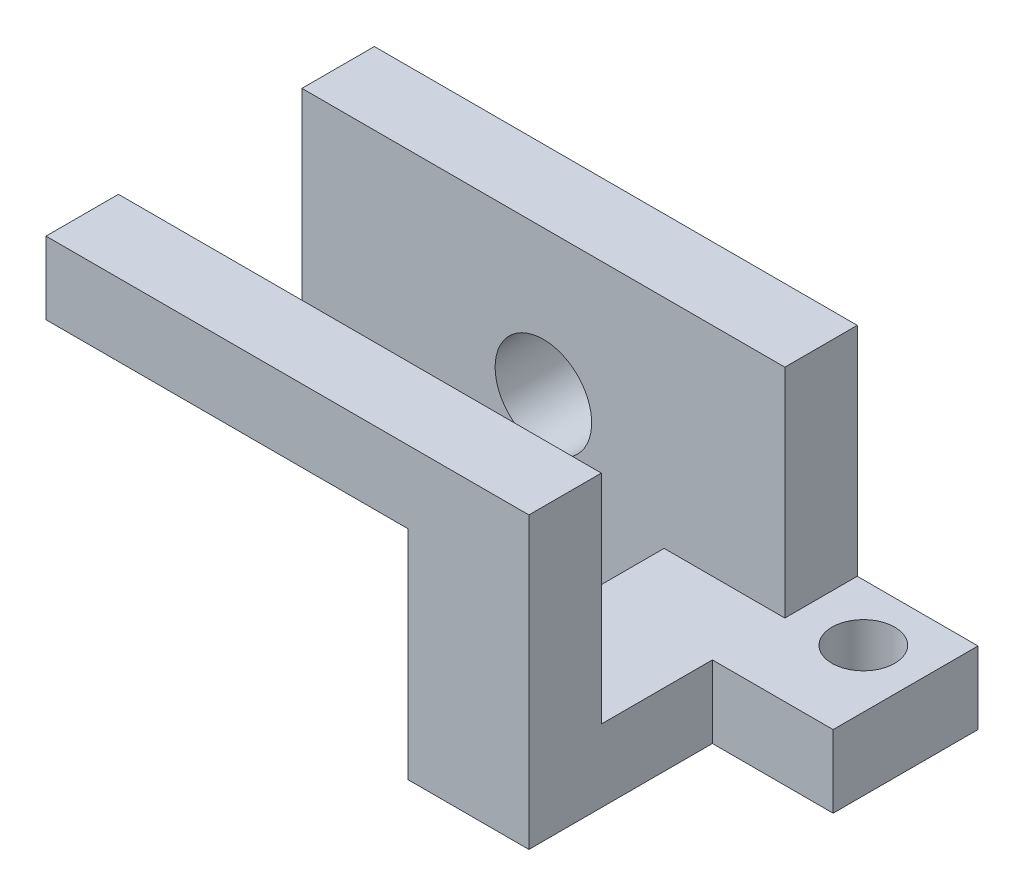
ISO-10303-21;
HEADER;
FILE_DESCRIPTION(('STEP AP214'),'2;1');
FILE_NAME('part.step','',(''),(''),'','','');
FILE_SCHEMA(('AUTOMOTIVE_DESIGN { 1 0 10303 214 1 1 1 1 }'));
ENDSEC;
DATA;
#1=APPLICATION_CONTEXT('core data for automotive mechanical design processes');
#2=APPLICATION_PROTOCOL_DEFINITION('international standard','automotive_design',2000,#1);
#3=PRODUCT_CONTEXT('',#1,'mechanical');
#4=PRODUCT('Part','Part','',(#3));
#5=PRODUCT_RELATED_PRODUCT_CATEGORY('part','',(#4));
#6=PRODUCT_DEFINITION_FORMATION('','',#4);
#7=PRODUCT_DEFINITION_CONTEXT('part definition',#1,'design');
#8=PRODUCT_DEFINITION('design','',#6,#7);
#9=PRODUCT_DEFINITION_SHAPE('','',#8);
#10=(LENGTH_UNIT() NAMED_UNIT(*) SI_UNIT(.MILLI.,.METRE.));
#11=(NAMED_UNIT(*) PLANE_ANGLE_UNIT() SI_UNIT($,.RADIAN.));
#12=(NAMED_UNIT(*) SI_UNIT($,.STERADIAN.) SOLID_ANGLE_UNIT());
#13=UNCERTAINTY_MEASURE_WITH_UNIT(LENGTH_MEASURE(1.E-05),#10,'distance_accuracy_value','');
#14=(GEOMETRIC_REPRESENTATION_CONTEXT(3) GLOBAL_UNCERTAINTY_ASSIGNED_CONTEXT((#13)) GLOBAL_UNIT_ASSIGNED_CONTEXT((#10,
#11,#12)) REPRESENTATION_CONTEXT('',''));
#15=CARTESIAN_POINT('',(0.,0.,0.));
#16=DIRECTION('',(0.,0.,1.));
#17=DIRECTION('',(1.,0.,0.));
#18=AXIS2_PLACEMENT_3D('',#15,#16,#17);
#19=CARTESIAN_POINT('',(0.,0.,15.));
#20=DIRECTION('',(-1.,0.,0.));
#21=DIRECTION('',(0.,0.,1.));
#22=AXIS2_PLACEMENT_3D('',#19,#20,#21);
#23=PLANE('',#22);
#24=DIRECTION('',(0.,-1.,0.));
#25=VECTOR('',#24,1.);
#26=CARTESIAN_POINT('',(0.,0.,30.));
#27=LINE('',#26,#25);
#28=CARTESIAN_POINT('',(0.,15.,30.));
#29=VERTEX_POINT('',#28);
#30=CARTESIAN_POINT('',(0.,0.,30.));
#31=VERTEX_POINT('',#30);
#32=EDGE_CURVE('E159',#29,#31,#27,.T.);
#33=ORIENTED_EDGE('',*,*,#32,.F.);
#34=DIRECTION('',(0.,0.,-1.));
#35=VECTOR('',#34,1.);
#36=CARTESIAN_POINT('',(0.,15.,53.));
#37=LINE('',#36,#35);
#38=CARTESIAN_POINT('',(0.,15.,53.));
#39=VERTEX_POINT('',#38);
#40=EDGE_CURVE('E219',#39,#29,#37,.T.);
#41=ORIENTED_EDGE('',*,*,#40,.F.);
#42=DIRECTION('',(0.,1.,0.));
#43=VECTOR('',#42,1.);
#44=CARTESIAN_POINT('',(0.,0.,53.));
#45=LINE('',#44,#43);
#46=CARTESIAN_POINT('',(0.,60.,53.));
#47=VERTEX_POINT('',#46);
#48=EDGE_CURVE('E182',#39,#47,#45,.T.);
#49=ORIENTED_EDGE('',*,*,#48,.T.);
#50=DIRECTION('',(0.,0.,-1.));
#51=VECTOR('',#50,1.);
#52=CARTESIAN_POINT('',(0.,60.,68.));
#53=LINE('',#52,#51);
#54=CARTESIAN_POINT('',(0.,60.,68.));
#55=VERTEX_POINT('',#54);
#56=EDGE_CURVE('E203',#55,#47,#53,.T.);
#57=ORIENTED_EDGE('',*,*,#56,.F.);
#58=DIRECTION('',(0.,1.,0.));
#59=VECTOR('',#58,1.);
#60=CARTESIAN_POINT('',(0.,0.,68.));
#61=LINE('',#60,#59);
#62=CARTESIAN_POINT('',(0.,0.,68.));
#63=VERTEX_POINT('',#62);
#64=EDGE_CURVE('E184',#63,#55,#61,.T.);
#65=ORIENTED_EDGE('',*,*,#64,.F.);
#66=DIRECTION('',(0.,0.,-1.));
#67=VECTOR('',#66,1.);
#68=CARTESIAN_POINT('',(0.,0.,15.));
#69=LINE('',#68,#67);
#70=EDGE_CURVE('E229',#63,#31,#69,.T.);
#71=ORIENTED_EDGE('',*,*,#70,.T.);
#72=EDGE_LOOP('',(#33,#41,#49,#57,#65,#71));
#73=FACE_BOUND('',#72,.T.);
#74=ADVANCED_FACE('F39',(#73),#23,.F.);
#75=DIRECTION('',(0.,0.,1.));
#76=VECTOR('',#75,1.);
#77=CARTESIAN_POINT('',(0.,15.,0.));
#78=LINE('',#77,#76);
#79=CARTESIAN_POINT('',(0.,15.,0.));
#80=VERTEX_POINT('',#79);
#81=CARTESIAN_POINT('',(0.,15.,15.));
#82=VERTEX_POINT('',#81);
#83=EDGE_CURVE('E274',#80,#82,#78,.T.);
#84=ORIENTED_EDGE('',*,*,#83,.F.);
#85=DIRECTION('',(0.,1.,0.));
#86=VECTOR('',#85,1.);
#87=CARTESIAN_POINT('',(0.,0.,0.));
#88=LINE('',#87,#86);
#89=CARTESIAN_POINT('',(0.,60.,0.));
#90=VERTEX_POINT('',#89);
#91=EDGE_CURVE('E164',#80,#90,#88,.T.);
#92=ORIENTED_EDGE('',*,*,#91,.T.);
#93=DIRECTION('',(0.,0.,-1.));
#94=VECTOR('',#93,1.);
#95=CARTESIAN_POINT('',(0.,60.,15.));
#96=LINE('',#95,#94);
#97=CARTESIAN_POINT('',(0.,60.,15.));
#98=VERTEX_POINT('',#97);
#99=EDGE_CURVE('E11',#98,#90,#96,.T.);
#100=ORIENTED_EDGE('',*,*,#99,.F.);
#101=DIRECTION('',(0.,1.,0.));
#102=VECTOR('',#101,1.);
#103=CARTESIAN_POINT('',(0.,0.,15.));
#104=LINE('',#103,#102);
#105=EDGE_CURVE('E221',#82,#98,#104,.T.);
#106=ORIENTED_EDGE('',*,*,#105,.F.);
#107=EDGE_LOOP('',(#84,#92,#100,#106));
#108=FACE_BOUND('',#107,.T.);
#109=ADVANCED_FACE('F279',(#108),#23,.F.);
#110=CARTESIAN_POINT('',(0.,60.,15.));
#111=DIRECTION('',(0.,-1.,0.));
#112=DIRECTION('',(1.,0.,0.));
#113=AXIS2_PLACEMENT_3D('',#110,#111,#112);
#114=PLANE('',#113);
#115=DIRECTION('',(-1.,0.,0.));
#116=VECTOR('',#115,1.);
#117=CARTESIAN_POINT('',(0.,60.,0.));
#118=LINE('',#117,#116);
#119=CARTESIAN_POINT('',(-100.,60.,0.));
#120=VERTEX_POINT('',#119);
#121=EDGE_CURVE('E231',#90,#120,#118,.T.);
#122=ORIENTED_EDGE('',*,*,#121,.T.);
#123=DIRECTION('',(0.,0.,-1.));
#124=VECTOR('',#123,1.);
#125=CARTESIAN_POINT('',(-100.,60.,15.));
#126=LINE('',#125,#124);
#127=CARTESIAN_POINT('',(-100.,60.,15.));
#128=VERTEX_POINT('',#127);
#129=EDGE_CURVE('E46',#128,#120,#126,.T.);
#130=ORIENTED_EDGE('',*,*,#129,.F.);
#131=DIRECTION('',(-1.,0.,0.));
#132=VECTOR('',#131,1.);
#133=CARTESIAN_POINT('',(0.,60.,15.));
#134=LINE('',#133,#132);
#135=EDGE_CURVE('E223',#98,#128,#134,.T.);
#136=ORIENTED_EDGE('',*,*,#135,.F.);
#137=ORIENTED_EDGE('',*,*,#99,.T.);
#138=EDGE_LOOP('',(#122,#130,#136,#137));
#139=FACE_BOUND('',#138,.T.);
#140=ADVANCED_FACE('F280',(#139),#114,.F.);
#141=CARTESIAN_POINT('',(-100.,0.,15.));
#142=DIRECTION('',(1.,0.,0.));
#143=DIRECTION('',(0.,0.,-1.));
#144=AXIS2_PLACEMENT_3D('',#141,#142,#143);
#145=PLANE('',#144);
#146=DIRECTION('',(0.,-1.,0.));
#147=VECTOR('',#146,1.);
#148=CARTESIAN_POINT('',(-100.,0.,0.));
#149=LINE('',#148,#147);
#150=CARTESIAN_POINT('',(-100.,0.,0.));
#151=VERTEX_POINT('',#150);
#152=EDGE_CURVE('E233',#120,#151,#149,.T.);
#153=ORIENTED_EDGE('',*,*,#152,.T.);
#154=DIRECTION('',(0.,0.,-1.));
#155=VECTOR('',#154,1.);
#156=CARTESIAN_POINT('',(-100.,0.,15.));
#157=LINE('',#156,#155);
#158=CARTESIAN_POINT('',(-100.,0.,15.));
#159=VERTEX_POINT('',#158);
#160=EDGE_CURVE('E238',#159,#151,#157,.T.);
#161=ORIENTED_EDGE('',*,*,#160,.F.);
#162=DIRECTION('',(0.,-1.,0.));
#163=VECTOR('',#162,1.);
#164=CARTESIAN_POINT('',(-100.,0.,15.));
#165=LINE('',#164,#163);
#166=EDGE_CURVE('E226',#128,#159,#165,.T.);
#167=ORIENTED_EDGE('',*,*,#166,.F.);
#168=ORIENTED_EDGE('',*,*,#129,.T.);
#169=EDGE_LOOP('',(#153,#161,#167,#168));
#170=FACE_BOUND('',#169,.T.);
#171=ADVANCED_FACE('F245',(#170),#145,.F.);
#172=CARTESIAN_POINT('',(0.,0.,15.));
#173=DIRECTION('',(0.,1.,0.));
#174=DIRECTION('',(0.,0.,1.));
#175=AXIS2_PLACEMENT_3D('',#172,#173,#174);
#176=PLANE('',#175);
#177=CARTESIAN_POINT('',(13.,0.,11.7414052517134));
#178=DIRECTION('',(0.,1.,0.));
#179=DIRECTION('',(-1.,0.,0.));
#180=AXIS2_PLACEMENT_3D('',#177,#178,#179);
#181=CIRCLE('',#180,6.5);
#182=CARTESIAN_POINT('',(6.50000000000001,0.,11.7414052517134));
#183=VERTEX_POINT('',#182);
#184=EDGE_CURVE('E297',#183,#183,#181,.T.);
#185=ORIENTED_EDGE('',*,*,#184,.T.);
#186=EDGE_LOOP('',(#185));
#187=FACE_BOUND('',#186,.T.);
#188=DIRECTION('',(1.,0.,0.));
#189=VECTOR('',#188,1.);
#190=CARTESIAN_POINT('',(0.,0.,68.));
#191=LINE('',#190,#189);
#192=CARTESIAN_POINT('',(-25.,0.,68.));
#193=VERTEX_POINT('',#192);
#194=EDGE_CURVE('E193',#193,#63,#191,.T.);
#195=ORIENTED_EDGE('',*,*,#194,.F.);
#196=DIRECTION('',(0.,0.,-1.));
#197=VECTOR('',#196,1.);
#198=CARTESIAN_POINT('',(-25.,0.,53.));
#199=LINE('',#198,#197);
#200=CARTESIAN_POINT('',(-25.,0.,15.));
#201=VERTEX_POINT('',#200);
#202=EDGE_CURVE('E210',#193,#201,#199,.T.);
#203=ORIENTED_EDGE('',*,*,#202,.T.);
#204=DIRECTION('',(1.,0.,0.));
#205=VECTOR('',#204,1.);
#206=CARTESIAN_POINT('',(0.,0.,15.));
#207=LINE('',#206,#205);
#208=EDGE_CURVE('E61',#159,#201,#207,.T.);
#209=ORIENTED_EDGE('',*,*,#208,.F.);
#210=ORIENTED_EDGE('',*,*,#160,.T.);
#211=DIRECTION('',(1.,0.,0.));
#212=VECTOR('',#211,1.);
#213=CARTESIAN_POINT('',(0.,0.,0.));
#214=LINE('',#213,#212);
#215=CARTESIAN_POINT('',(25.,0.,0.));
#216=VERTEX_POINT('',#215);
#217=EDGE_CURVE('E224',#151,#216,#214,.T.);
#218=ORIENTED_EDGE('',*,*,#217,.T.);
#219=DIRECTION('',(0.,0.,-1.));
#220=VECTOR('',#219,1.);
#221=CARTESIAN_POINT('',(25.,0.,0.));
#222=LINE('',#221,#220);
#223=CARTESIAN_POINT('',(25.,0.,30.));
#224=VERTEX_POINT('',#223);
#225=EDGE_CURVE('E156',#224,#216,#222,.T.);
#226=ORIENTED_EDGE('',*,*,#225,.F.);
#227=DIRECTION('',(-1.,0.,0.));
#228=VECTOR('',#227,1.);
#229=CARTESIAN_POINT('',(25.,0.,30.));
#230=LINE('',#229,#228);
#231=EDGE_CURVE('E169',#224,#31,#230,.T.);
#232=ORIENTED_EDGE('',*,*,#231,.T.);
#233=ORIENTED_EDGE('',*,*,#70,.F.);
#234=EDGE_LOOP('',(#195,#203,#209,#210,#218,#226,#232,#233));
#235=FACE_BOUND('',#234,.T.);
#236=ADVANCED_FACE('F251',(#187,#235),#176,.F.);
#237=CARTESIAN_POINT('',(0.,0.,15.));
#238=DIRECTION('',(0.,0.,1.));
#239=DIRECTION('',(1.,0.,0.));
#240=AXIS2_PLACEMENT_3D('',#237,#238,#239);
#241=PLANE('',#240);
#242=CARTESIAN_POINT('',(-50.,30.,15.));
#243=DIRECTION('',(0.,0.,-1.));
#244=DIRECTION('',(-1.,0.,0.));
#245=AXIS2_PLACEMENT_3D('',#242,#243,#244);
#246=CIRCLE('',#245,10.);
#247=CARTESIAN_POINT('',(-60.,30.,15.));
#248=VERTEX_POINT('',#247);
#249=EDGE_CURVE('E305',#248,#248,#246,.T.);
#250=ORIENTED_EDGE('',*,*,#249,.T.);
#251=EDGE_LOOP('',(#250));
#252=FACE_BOUND('',#251,.T.);
#253=DIRECTION('',(0.,-1.,0.));
#254=VECTOR('',#253,1.);
#255=CARTESIAN_POINT('',(-25.,0.,15.));
#256=LINE('',#255,#254);
#257=CARTESIAN_POINT('',(-25.,15.,15.));
#258=VERTEX_POINT('',#257);
#259=EDGE_CURVE('E211',#258,#201,#256,.T.);
#260=ORIENTED_EDGE('',*,*,#259,.F.);
#261=DIRECTION('',(-1.,0.,0.));
#262=VECTOR('',#261,1.);
#263=CARTESIAN_POINT('',(0.,15.,15.));
#264=LINE('',#263,#262);
#265=EDGE_CURVE('E206',#82,#258,#264,.T.);
#266=ORIENTED_EDGE('',*,*,#265,.F.);
#267=ORIENTED_EDGE('',*,*,#105,.T.);
#268=ORIENTED_EDGE('',*,*,#135,.T.);
#269=ORIENTED_EDGE('',*,*,#166,.T.);
#270=ORIENTED_EDGE('',*,*,#208,.T.);
#271=EDGE_LOOP('',(#260,#266,#267,#268,#269,#270));
#272=FACE_BOUND('',#271,.T.);
#273=ADVANCED_FACE('F276',(#252,#272),#241,.T.);
#274=CARTESIAN_POINT('',(0.,0.,0.));
#275=DIRECTION('',(0.,0.,1.));
#276=DIRECTION('',(1.,0.,0.));
#277=AXIS2_PLACEMENT_3D('',#274,#275,#276);
#278=PLANE('',#277);
#279=CARTESIAN_POINT('',(-50.,30.,0.));
#280=DIRECTION('',(0.,0.,-1.));
#281=DIRECTION('',(-1.,0.,0.));
#282=AXIS2_PLACEMENT_3D('',#279,#280,#281);
#283=CIRCLE('',#282,10.);
#284=CARTESIAN_POINT('',(-60.,30.,0.));
#285=VERTEX_POINT('',#284);
#286=EDGE_CURVE('E308',#285,#285,#283,.T.);
#287=ORIENTED_EDGE('',*,*,#286,.F.);
#288=EDGE_LOOP('',(#287));
#289=FACE_BOUND('',#288,.T.);
#290=ORIENTED_EDGE('',*,*,#91,.F.);
#291=DIRECTION('',(-1.,0.,0.));
#292=VECTOR('',#291,1.);
#293=CARTESIAN_POINT('',(25.,15.,0.));
#294=LINE('',#293,#292);
#295=CARTESIAN_POINT('',(25.,15.,0.));
#296=VERTEX_POINT('',#295);
#297=EDGE_CURVE('E143',#296,#80,#294,.T.);
#298=ORIENTED_EDGE('',*,*,#297,.F.);
#299=DIRECTION('',(0.,1.,0.));
#300=VECTOR('',#299,1.);
#301=CARTESIAN_POINT('',(25.,0.,0.));
#302=LINE('',#301,#300);
#303=EDGE_CURVE('E150',#216,#296,#302,.T.);
#304=ORIENTED_EDGE('',*,*,#303,.F.);
#305=ORIENTED_EDGE('',*,*,#217,.F.);
#306=ORIENTED_EDGE('',*,*,#152,.F.);
#307=ORIENTED_EDGE('',*,*,#121,.F.);
#308=EDGE_LOOP('',(#290,#298,#304,#305,#306,#307));
#309=FACE_BOUND('',#308,.T.);
#310=ADVANCED_FACE('F162',(#289,#309),#278,.F.);
#311=CARTESIAN_POINT('',(0.,15.,53.));
#312=DIRECTION('',(0.,-1.,0.));
#313=DIRECTION('',(1.,0.,0.));
#314=AXIS2_PLACEMENT_3D('',#311,#312,#313);
#315=PLANE('',#314);
#316=CARTESIAN_POINT('',(13.,15.,11.7414052517134));
#317=DIRECTION('',(0.,1.,0.));
#318=DIRECTION('',(-1.,0.,0.));
#319=AXIS2_PLACEMENT_3D('',#316,#317,#318);
#320=CIRCLE('',#319,6.5);
#321=CARTESIAN_POINT('',(6.5,15.,11.7414052517134));
#322=VERTEX_POINT('',#321);
#323=EDGE_CURVE('E302',#322,#322,#320,.T.);
#324=ORIENTED_EDGE('',*,*,#323,.F.);
#325=EDGE_LOOP('',(#324));
#326=FACE_BOUND('',#325,.T.);
#327=ORIENTED_EDGE('',*,*,#265,.T.);
#328=DIRECTION('',(0.,0.,-1.));
#329=VECTOR('',#328,1.);
#330=CARTESIAN_POINT('',(-25.,15.,53.));
#331=LINE('',#330,#329);
#332=CARTESIAN_POINT('',(-25.,15.,53.));
#333=VERTEX_POINT('',#332);
#334=EDGE_CURVE('E216',#333,#258,#331,.T.);
#335=ORIENTED_EDGE('',*,*,#334,.F.);
#336=DIRECTION('',(-1.,0.,0.));
#337=VECTOR('',#336,1.);
#338=CARTESIAN_POINT('',(0.,15.,53.));
#339=LINE('',#338,#337);
#340=EDGE_CURVE('E207',#39,#333,#339,.T.);
#341=ORIENTED_EDGE('',*,*,#340,.F.);
#342=ORIENTED_EDGE('',*,*,#40,.T.);
#343=DIRECTION('',(-1.,0.,0.));
#344=VECTOR('',#343,1.);
#345=CARTESIAN_POINT('',(25.,15.,30.));
#346=LINE('',#345,#344);
#347=CARTESIAN_POINT('',(25.,15.,30.));
#348=VERTEX_POINT('',#347);
#349=EDGE_CURVE('E146',#348,#29,#346,.T.);
#350=ORIENTED_EDGE('',*,*,#349,.F.);
#351=DIRECTION('',(0.,0.,1.));
#352=VECTOR('',#351,1.);
#353=CARTESIAN_POINT('',(25.,15.,0.));
#354=LINE('',#353,#352);
#355=EDGE_CURVE('E138',#296,#348,#354,.T.);
#356=ORIENTED_EDGE('',*,*,#355,.F.);
#357=ORIENTED_EDGE('',*,*,#297,.T.);
#358=ORIENTED_EDGE('',*,*,#83,.T.);
#359=EDGE_LOOP('',(#327,#335,#341,#342,#350,#356,#357,#358));
#360=FACE_BOUND('',#359,.T.);
#361=ADVANCED_FACE('F141',(#326,#360),#315,.F.);
#362=CARTESIAN_POINT('',(-25.,0.,53.));
#363=DIRECTION('',(1.,0.,0.));
#364=DIRECTION('',(0.,0.,-1.));
#365=AXIS2_PLACEMENT_3D('',#362,#363,#364);
#366=PLANE('',#365);
#367=ORIENTED_EDGE('',*,*,#259,.T.);
#368=ORIENTED_EDGE('',*,*,#202,.F.);
#369=DIRECTION('',(0.,-1.,0.));
#370=VECTOR('',#369,1.);
#371=CARTESIAN_POINT('',(-25.,0.,68.));
#372=LINE('',#371,#370);
#373=CARTESIAN_POINT('',(-25.,45.,68.));
#374=VERTEX_POINT('',#373);
#375=EDGE_CURVE('E53',#374,#193,#372,.T.);
#376=ORIENTED_EDGE('',*,*,#375,.F.);
#377=DIRECTION('',(0.,0.,-1.));
#378=VECTOR('',#377,1.);
#379=CARTESIAN_POINT('',(-25.,45.,68.));
#380=LINE('',#379,#378);
#381=CARTESIAN_POINT('',(-25.,45.,53.));
#382=VERTEX_POINT('',#381);
#383=EDGE_CURVE('E180',#374,#382,#380,.T.);
#384=ORIENTED_EDGE('',*,*,#383,.T.);
#385=DIRECTION('',(0.,-1.,0.));
#386=VECTOR('',#385,1.);
#387=CARTESIAN_POINT('',(-25.,0.,53.));
#388=LINE('',#387,#386);
#389=EDGE_CURVE('E165',#382,#333,#388,.T.);
#390=ORIENTED_EDGE('',*,*,#389,.T.);
#391=ORIENTED_EDGE('',*,*,#334,.T.);
#392=EDGE_LOOP('',(#367,#368,#376,#384,#390,#391));
#393=FACE_BOUND('',#392,.T.);
#394=ADVANCED_FACE('F254',(#393),#366,.F.);
#395=CARTESIAN_POINT('',(0.,0.,53.));
#396=DIRECTION('',(0.,0.,1.));
#397=DIRECTION('',(1.,0.,0.));
#398=AXIS2_PLACEMENT_3D('',#395,#396,#397);
#399=PLANE('',#398);
#400=ORIENTED_EDGE('',*,*,#340,.T.);
#401=ORIENTED_EDGE('',*,*,#389,.F.);
#402=DIRECTION('',(1.,0.,0.));
#403=VECTOR('',#402,1.);
#404=CARTESIAN_POINT('',(-25.,45.,53.));
#405=LINE('',#404,#403);
#406=CARTESIAN_POINT('',(-100.,45.,53.));
#407=VERTEX_POINT('',#406);
#408=EDGE_CURVE('E167',#407,#382,#405,.T.);
#409=ORIENTED_EDGE('',*,*,#408,.F.);
#410=DIRECTION('',(0.,-1.,0.));
#411=VECTOR('',#410,1.);
#412=CARTESIAN_POINT('',(-100.,0.,53.));
#413=LINE('',#412,#411);
#414=CARTESIAN_POINT('',(-100.,60.,53.));
#415=VERTEX_POINT('',#414);
#416=EDGE_CURVE('E188',#415,#407,#413,.T.);
#417=ORIENTED_EDGE('',*,*,#416,.F.);
#418=DIRECTION('',(-1.,0.,0.));
#419=VECTOR('',#418,1.);
#420=CARTESIAN_POINT('',(0.,60.,53.));
#421=LINE('',#420,#419);
#422=EDGE_CURVE('E197',#47,#415,#421,.T.);
#423=ORIENTED_EDGE('',*,*,#422,.F.);
#424=ORIENTED_EDGE('',*,*,#48,.F.);
#425=EDGE_LOOP('',(#400,#401,#409,#417,#423,#424));
#426=FACE_BOUND('',#425,.T.);
#427=ADVANCED_FACE('F268',(#426),#399,.F.);
#428=CARTESIAN_POINT('',(0.,60.,68.));
#429=DIRECTION('',(0.,-1.,0.));
#430=DIRECTION('',(0.,0.,-1.));
#431=AXIS2_PLACEMENT_3D('',#428,#429,#430);
#432=PLANE('',#431);
#433=ORIENTED_EDGE('',*,*,#422,.T.);
#434=DIRECTION('',(0.,0.,-1.));
#435=VECTOR('',#434,1.);
#436=CARTESIAN_POINT('',(-100.,60.,68.));
#437=LINE('',#436,#435);
#438=CARTESIAN_POINT('',(-100.,60.,68.));
#439=VERTEX_POINT('',#438);
#440=EDGE_CURVE('E195',#439,#415,#437,.T.);
#441=ORIENTED_EDGE('',*,*,#440,.F.);
#442=DIRECTION('',(-1.,0.,0.));
#443=VECTOR('',#442,1.);
#444=CARTESIAN_POINT('',(0.,60.,68.));
#445=LINE('',#444,#443);
#446=EDGE_CURVE('E187',#55,#439,#445,.T.);
#447=ORIENTED_EDGE('',*,*,#446,.F.);
#448=ORIENTED_EDGE('',*,*,#56,.T.);
#449=EDGE_LOOP('',(#433,#441,#447,#448));
#450=FACE_BOUND('',#449,.T.);
#451=ADVANCED_FACE('F355',(#450),#432,.F.);
#452=CARTESIAN_POINT('',(-100.,0.,68.));
#453=DIRECTION('',(1.,0.,0.));
#454=DIRECTION('',(0.,0.,-1.));
#455=AXIS2_PLACEMENT_3D('',#452,#453,#454);
#456=PLANE('',#455);
#457=ORIENTED_EDGE('',*,*,#416,.T.);
#458=DIRECTION('',(0.,0.,-1.));
#459=VECTOR('',#458,1.);
#460=CARTESIAN_POINT('',(-100.,45.,68.));
#461=LINE('',#460,#459);
#462=CARTESIAN_POINT('',(-100.,45.,68.));
#463=VERTEX_POINT('',#462);
#464=EDGE_CURVE('E176',#463,#407,#461,.T.);
#465=ORIENTED_EDGE('',*,*,#464,.F.);
#466=DIRECTION('',(0.,-1.,0.));
#467=VECTOR('',#466,1.);
#468=CARTESIAN_POINT('',(-100.,0.,68.));
#469=LINE('',#468,#467);
#470=EDGE_CURVE('E190',#439,#463,#469,.T.);
#471=ORIENTED_EDGE('',*,*,#470,.F.);
#472=ORIENTED_EDGE('',*,*,#440,.T.);
#473=EDGE_LOOP('',(#457,#465,#471,#472));
#474=FACE_BOUND('',#473,.T.);
#475=ADVANCED_FACE('F263',(#474),#456,.F.);
#476=CARTESIAN_POINT('',(0.,0.,68.));
#477=DIRECTION('',(0.,0.,1.));
#478=DIRECTION('',(1.,0.,0.));
#479=AXIS2_PLACEMENT_3D('',#476,#477,#478);
#480=PLANE('',#479);
#481=ORIENTED_EDGE('',*,*,#375,.T.);
#482=ORIENTED_EDGE('',*,*,#194,.T.);
#483=ORIENTED_EDGE('',*,*,#64,.T.);
#484=ORIENTED_EDGE('',*,*,#446,.T.);
#485=ORIENTED_EDGE('',*,*,#470,.T.);
#486=DIRECTION('',(1.,0.,0.));
#487=VECTOR('',#486,1.);
#488=CARTESIAN_POINT('',(-25.,45.,68.));
#489=LINE('',#488,#487);
#490=EDGE_CURVE('E174',#463,#374,#489,.T.);
#491=ORIENTED_EDGE('',*,*,#490,.T.);
#492=EDGE_LOOP('',(#481,#482,#483,#484,#485,#491));
#493=FACE_BOUND('',#492,.T.);
#494=ADVANCED_FACE('F256',(#493),#480,.T.);
#495=CARTESIAN_POINT('',(-25.,45.,68.));
#496=DIRECTION('',(0.,1.,0.));
#497=DIRECTION('',(0.,0.,1.));
#498=AXIS2_PLACEMENT_3D('',#495,#496,#497);
#499=PLANE('',#498);
#500=ORIENTED_EDGE('',*,*,#408,.T.);
#501=ORIENTED_EDGE('',*,*,#383,.F.);
#502=ORIENTED_EDGE('',*,*,#490,.F.);
#503=ORIENTED_EDGE('',*,*,#464,.T.);
#504=EDGE_LOOP('',(#500,#501,#502,#503));
#505=FACE_BOUND('',#504,.T.);
#506=ADVANCED_FACE('F260',(#505),#499,.F.);
#507=CARTESIAN_POINT('',(25.,0.,30.));
#508=DIRECTION('',(0.,0.,-1.));
#509=DIRECTION('',(-1.,0.,0.));
#510=AXIS2_PLACEMENT_3D('',#507,#508,#509);
#511=PLANE('',#510);
#512=ORIENTED_EDGE('',*,*,#32,.T.);
#513=ORIENTED_EDGE('',*,*,#231,.F.);
#514=DIRECTION('',(0.,-1.,0.));
#515=VECTOR('',#514,1.);
#516=CARTESIAN_POINT('',(25.,0.,30.));
#517=LINE('',#516,#515);
#518=EDGE_CURVE('E149',#348,#224,#517,.T.);
#519=ORIENTED_EDGE('',*,*,#518,.F.);
#520=ORIENTED_EDGE('',*,*,#349,.T.);
#521=EDGE_LOOP('',(#512,#513,#519,#520));
#522=FACE_BOUND('',#521,.T.);
#523=ADVANCED_FACE('F345',(#522),#511,.F.);
#524=CARTESIAN_POINT('',(25.,0.,0.));
#525=DIRECTION('',(1.,0.,0.));
#526=DIRECTION('',(0.,0.,-1.));
#527=AXIS2_PLACEMENT_3D('',#524,#525,#526);
#528=PLANE('',#527);
#529=ORIENTED_EDGE('',*,*,#303,.T.);
#530=ORIENTED_EDGE('',*,*,#355,.T.);
#531=ORIENTED_EDGE('',*,*,#518,.T.);
#532=ORIENTED_EDGE('',*,*,#225,.T.);
#533=EDGE_LOOP('',(#529,#530,#531,#532));
#534=FACE_BOUND('',#533,.T.);
#535=ADVANCED_FACE('F154',(#534),#528,.T.);
#536=CARTESIAN_POINT('',(13.,0.,11.7414052517134));
#537=DIRECTION('',(0.,1.,0.));
#538=DIRECTION('',(-1.,0.,0.));
#539=AXIS2_PLACEMENT_3D('',#536,#537,#538);
#540=CYLINDRICAL_SURFACE('',#539,6.5);
#541=CARTESIAN_POINT('',(6.50000000000001,0.,11.7414052517134));
#542=CARTESIAN_POINT('',(6.50000000000001,0.156249999999999,11.7414052517134));
#543=CARTESIAN_POINT('',(6.50000000000001,0.312499999999999,11.7414052517134));
#544=CARTESIAN_POINT('',(6.50000000000001,0.624999999999999,11.7414052517134));
#545=CARTESIAN_POINT('',(6.50000000000001,0.781249999999999,11.7414052517134));
#546=CARTESIAN_POINT('',(6.50000000000001,1.09375,11.7414052517134));
#547=CARTESIAN_POINT('',(6.50000000000001,1.25,11.7414052517134));
#548=CARTESIAN_POINT('',(6.50000000000001,1.5625,11.7414052517134));
#549=CARTESIAN_POINT('',(6.50000000000001,1.71875,11.7414052517134));
#550=CARTESIAN_POINT('',(6.50000000000001,2.03125,11.7414052517134));
#551=CARTESIAN_POINT('',(6.50000000000001,2.1875,11.7414052517134));
#552=CARTESIAN_POINT('',(6.50000000000001,2.5,11.7414052517134));
#553=CARTESIAN_POINT('',(6.50000000000001,2.65625,11.7414052517134));
#554=CARTESIAN_POINT('',(6.50000000000001,2.96875,11.7414052517134));
#555=CARTESIAN_POINT('',(6.50000000000001,3.125,11.7414052517134));
#556=CARTESIAN_POINT('',(6.50000000000001,3.4375,11.7414052517134));
#557=CARTESIAN_POINT('',(6.50000000000001,3.59375,11.7414052517134));
#558=CARTESIAN_POINT('',(6.50000000000001,3.90625,11.7414052517134));
#559=CARTESIAN_POINT('',(6.50000000000001,4.0625,11.7414052517134));
#560=CARTESIAN_POINT('',(6.50000000000001,4.375,11.7414052517134));
#561=CARTESIAN_POINT('',(6.50000000000001,4.53125,11.7414052517134));
#562=CARTESIAN_POINT('',(6.50000000000001,4.84375,11.7414052517134));
#563=CARTESIAN_POINT('',(6.50000000000001,5.,11.7414052517134));
#564=CARTESIAN_POINT('',(6.50000000000001,5.3125,11.7414052517134));
#565=CARTESIAN_POINT('',(6.50000000000001,5.46875,11.7414052517134));
#566=CARTESIAN_POINT('',(6.50000000000001,5.78125,11.7414052517134));
#567=CARTESIAN_POINT('',(6.50000000000001,5.9375,11.7414052517134));
#568=CARTESIAN_POINT('',(6.50000000000001,6.25,11.7414052517134));
#569=CARTESIAN_POINT('',(6.50000000000001,6.40625,11.7414052517134));
#570=CARTESIAN_POINT('',(6.50000000000001,6.71875,11.7414052517134));
#571=CARTESIAN_POINT('',(6.50000000000001,6.875,11.7414052517134));
#572=CARTESIAN_POINT('',(6.50000000000001,7.1875,11.7414052517134));
#573=CARTESIAN_POINT('',(6.50000000000001,7.34375,11.7414052517134));
#574=CARTESIAN_POINT('',(6.50000000000001,7.65625,11.7414052517134));
#575=CARTESIAN_POINT('',(6.50000000000001,7.8125,11.7414052517134));
#576=CARTESIAN_POINT('',(6.50000000000001,8.125,11.7414052517134));
#577=CARTESIAN_POINT('',(6.50000000000001,8.28125,11.7414052517134));
#578=CARTESIAN_POINT('',(6.50000000000001,8.59375,11.7414052517134));
#579=CARTESIAN_POINT('',(6.50000000000001,8.75,11.7414052517134));
#580=CARTESIAN_POINT('',(6.50000000000001,9.0625,11.7414052517134));
#581=CARTESIAN_POINT('',(6.5,9.21875,11.7414052517134));
#582=CARTESIAN_POINT('',(6.5,9.53125,11.7414052517134));
#583=CARTESIAN_POINT('',(6.5,9.6875,11.7414052517134));
#584=CARTESIAN_POINT('',(6.5,10.,11.7414052517134));
#585=CARTESIAN_POINT('',(6.5,10.15625,11.7414052517134));
#586=CARTESIAN_POINT('',(6.5,10.46875,11.7414052517134));
#587=CARTESIAN_POINT('',(6.5,10.625,11.7414052517134));
#588=CARTESIAN_POINT('',(6.5,10.9375,11.7414052517134));
#589=CARTESIAN_POINT('',(6.5,11.09375,11.7414052517134));
#590=CARTESIAN_POINT('',(6.5,11.40625,11.7414052517134));
#591=CARTESIAN_POINT('',(6.5,11.5625,11.7414052517134));
#592=CARTESIAN_POINT('',(6.5,11.875,11.7414052517134));
#593=CARTESIAN_POINT('',(6.5,12.03125,11.7414052517134));
#594=CARTESIAN_POINT('',(6.5,12.34375,11.7414052517134));
#595=CARTESIAN_POINT('',(6.5,12.5,11.7414052517134));
#596=CARTESIAN_POINT('',(6.5,12.8125,11.7414052517134));
#597=CARTESIAN_POINT('',(6.5,12.96875,11.7414052517134));
#598=CARTESIAN_POINT('',(6.5,13.28125,11.7414052517134));
#599=CARTESIAN_POINT('',(6.5,13.4375,11.7414052517134));
#600=CARTESIAN_POINT('',(6.5,13.75,11.7414052517134));
#601=CARTESIAN_POINT('',(6.5,13.90625,11.7414052517134));
#602=CARTESIAN_POINT('',(6.5,14.21875,11.7414052517134));
#603=CARTESIAN_POINT('',(6.5,14.375,11.7414052517134));
#604=CARTESIAN_POINT('',(6.5,14.6875,11.7414052517134));
#605=CARTESIAN_POINT('',(6.5,14.84375,11.7414052517134));
#606=CARTESIAN_POINT('',(6.5,15.,11.7414052517134));
#607=B_SPLINE_CURVE_WITH_KNOTS('',3,(#541,#542,#543,#544,#545,#546,#547,#548,#549,#550,#551,
#552,#553,#554,#555,#556,#557,#558,#559,#560,#561,#562,#563,#564,#565,#566,#567,#568,#569,#570,
#571,#572,#573,#574,#575,#576,#577,#578,#579,#580,#581,#582,#583,#584,#585,#586,#587,#588,#589,
#590,#591,#592,#593,#594,#595,#596,#597,#598,#599,#600,#601,#602,#603,#604,#605,#606),
.UNSPECIFIED.,.F.,.F.,(4,2,2,2,2,2,2,2,2,2,2,2,2,2,2,2,2,2,2,2,2,2,2,2,2,2,2,2,2,2,2,2,4),(0.,
0.46875,0.9375,1.40625,1.875,2.34375,2.8125,3.28125,3.75,4.21875,4.6875,5.15625,5.625,6.09375,
6.5625,7.03125,7.5,7.96875,8.4375,8.90625,9.375,9.84375,10.3125,10.78125,11.25,11.71875,12.1875,
12.65625,13.125,13.59375,14.0625,14.53125,15.),.UNSPECIFIED.);
#608=EDGE_CURVE('BSEAM318',#183,#322,#607,.T.);
#609=ORIENTED_EDGE('',*,*,#184,.F.);
#610=ORIENTED_EDGE('',*,*,#323,.T.);
#611=ORIENTED_EDGE('',*,*,#608,.T.);
#612=ORIENTED_EDGE('',*,*,#608,.F.);
#613=EDGE_LOOP('',(#609,#611,#610,#612));
#614=FACE_BOUND('',#613,.T.);
#615=ADVANCED_FACE('F318',(#614),#540,.F.);
#616=CARTESIAN_POINT('',(-50.,30.,15.));
#617=DIRECTION('',(0.,0.,-1.));
#618=DIRECTION('',(-1.,0.,0.));
#619=AXIS2_PLACEMENT_3D('',#616,#617,#618);
#620=CYLINDRICAL_SURFACE('',#619,10.);
#621=CARTESIAN_POINT('',(-60.,30.,15.));
#622=CARTESIAN_POINT('',(-60.,30.,14.84375));
#623=CARTESIAN_POINT('',(-60.,30.,14.6875));
#624=CARTESIAN_POINT('',(-60.,30.,14.375));
#625=CARTESIAN_POINT('',(-60.,30.,14.21875));
#626=CARTESIAN_POINT('',(-60.,30.,13.90625));
#627=CARTESIAN_POINT('',(-60.,30.,13.75));
#628=CARTESIAN_POINT('',(-60.,30.,13.4375));
#629=CARTESIAN_POINT('',(-60.,30.,13.28125));
#630=CARTESIAN_POINT('',(-60.,30.,12.96875));
#631=CARTESIAN_POINT('',(-60.,30.,12.8125));
#632=CARTESIAN_POINT('',(-60.,30.,12.5));
#633=CARTESIAN_POINT('',(-60.,30.,12.34375));
#634=CARTESIAN_POINT('',(-60.,30.,12.03125));
#635=CARTESIAN_POINT('',(-60.,30.,11.875));
#636=CARTESIAN_POINT('',(-60.,30.,11.5625));
#637=CARTESIAN_POINT('',(-60.,30.,11.40625));
#638=CARTESIAN_POINT('',(-60.,30.,11.09375));
#639=CARTESIAN_POINT('',(-60.,30.,10.9375));
#640=CARTESIAN_POINT('',(-60.,30.,10.625));
#641=CARTESIAN_POINT('',(-60.,30.,10.46875));
#642=CARTESIAN_POINT('',(-60.,30.,10.15625));
#643=CARTESIAN_POINT('',(-60.,30.,10.));
#644=CARTESIAN_POINT('',(-60.,30.,9.6875));
#645=CARTESIAN_POINT('',(-60.,30.,9.53125));
#646=CARTESIAN_POINT('',(-60.,30.,9.21875));
#647=CARTESIAN_POINT('',(-60.,30.,9.0625));
#648=CARTESIAN_POINT('',(-60.,30.,8.75));
#649=CARTESIAN_POINT('',(-60.,30.,8.59375));
#650=CARTESIAN_POINT('',(-60.,30.,8.28125));
#651=CARTESIAN_POINT('',(-60.,30.,8.125));
#652=CARTESIAN_POINT('',(-60.,30.,7.8125));
#653=CARTESIAN_POINT('',(-60.,30.,7.65625));
#654=CARTESIAN_POINT('',(-60.,30.,7.34375));
#655=CARTESIAN_POINT('',(-60.,30.,7.1875));
#656=CARTESIAN_POINT('',(-60.,30.,6.875));
#657=CARTESIAN_POINT('',(-60.,30.,6.71875));
#658=CARTESIAN_POINT('',(-60.,30.,6.40625));
#659=CARTESIAN_POINT('',(-60.,30.,6.25));
#660=CARTESIAN_POINT('',(-60.,30.,5.9375));
#661=CARTESIAN_POINT('',(-60.,30.,5.78125));
#662=CARTESIAN_POINT('',(-60.,30.,5.46875));
#663=CARTESIAN_POINT('',(-60.,30.,5.3125));
#664=CARTESIAN_POINT('',(-60.,30.,5.));
#665=CARTESIAN_POINT('',(-60.,30.,4.84375));
#666=CARTESIAN_POINT('',(-60.,30.,4.53125));
#667=CARTESIAN_POINT('',(-60.,30.,4.375));
#668=CARTESIAN_POINT('',(-60.,30.,4.0625));
#669=CARTESIAN_POINT('',(-60.,30.,3.90625));
#670=CARTESIAN_POINT('',(-60.,30.,3.59375));
#671=CARTESIAN_POINT('',(-60.,30.,3.4375));
#672=CARTESIAN_POINT('',(-60.,30.,3.125));
#673=CARTESIAN_POINT('',(-60.,30.,2.96875));
#674=CARTESIAN_POINT('',(-60.,30.,2.65625));
#675=CARTESIAN_POINT('',(-60.,30.,2.5));
#676=CARTESIAN_POINT('',(-60.,30.,2.1875));
#677=CARTESIAN_POINT('',(-60.,30.,2.03125));
#678=CARTESIAN_POINT('',(-60.,30.,1.71875));
#679=CARTESIAN_POINT('',(-60.,30.,1.5625));
#680=CARTESIAN_POINT('',(-60.,30.,1.25));
#681=CARTESIAN_POINT('',(-60.,30.,1.09375));
#682=CARTESIAN_POINT('',(-60.,30.,0.781250000000001));
#683=CARTESIAN_POINT('',(-60.,30.,0.625000000000001));
#684=CARTESIAN_POINT('',(-60.,30.,0.3125));
#685=CARTESIAN_POINT('',(-60.,30.,0.15625));
#686=CARTESIAN_POINT('',(-60.,30.,0.));
#687=B_SPLINE_CURVE_WITH_KNOTS('',3,(#621,#622,#623,#624,#625,#626,#627,#628,#629,#630,#631,
#632,#633,#634,#635,#636,#637,#638,#639,#640,#641,#642,#643,#644,#645,#646,#647,#648,#649,#650,
#651,#652,#653,#654,#655,#656,#657,#658,#659,#660,#661,#662,#663,#664,#665,#666,#667,#668,#669,
#670,#671,#672,#673,#674,#675,#676,#677,#678,#679,#680,#681,#682,#683,#684,#685,#686),
.UNSPECIFIED.,.F.,.F.,(4,2,2,2,2,2,2,2,2,2,2,2,2,2,2,2,2,2,2,2,2,2,2,2,2,2,2,2,2,2,2,2,4),(0.,
0.468749999999999,0.937499999999999,1.40625,1.875,2.34375,2.8125,3.28125,3.75,4.21875,4.6875,
5.15625,5.625,6.09375,6.5625,7.03125,7.5,7.96875,8.4375,8.90625,9.375,9.84375,10.3125,10.78125,
11.25,11.71875,12.1875,12.65625,13.125,13.59375,14.0625,14.53125,15.),.UNSPECIFIED.);
#688=EDGE_CURVE('BSEAM315',#248,#285,#687,.T.);
#689=ORIENTED_EDGE('',*,*,#249,.F.);
#690=ORIENTED_EDGE('',*,*,#286,.T.);
#691=ORIENTED_EDGE('',*,*,#688,.T.);
#692=ORIENTED_EDGE('',*,*,#688,.F.);
#693=EDGE_LOOP('',(#689,#691,#690,#692));
#694=FACE_BOUND('',#693,.T.);
#695=ADVANCED_FACE('F315',(#694),#620,.F.);
#696=CLOSED_SHELL('',(#74,#109,#140,#171,#236,#273,#310,#361,#394,#427,#451,#475,#494,#506,#523,
#535,#615,#695));
#697=MANIFOLD_SOLID_BREP('B2',#696);
#698=ADVANCED_BREP_SHAPE_REPRESENTATION('',(#18,#697),#14);
#699=SHAPE_DEFINITION_REPRESENTATION(#9,#698);
ENDSEC;
END-ISO-10303-21;
